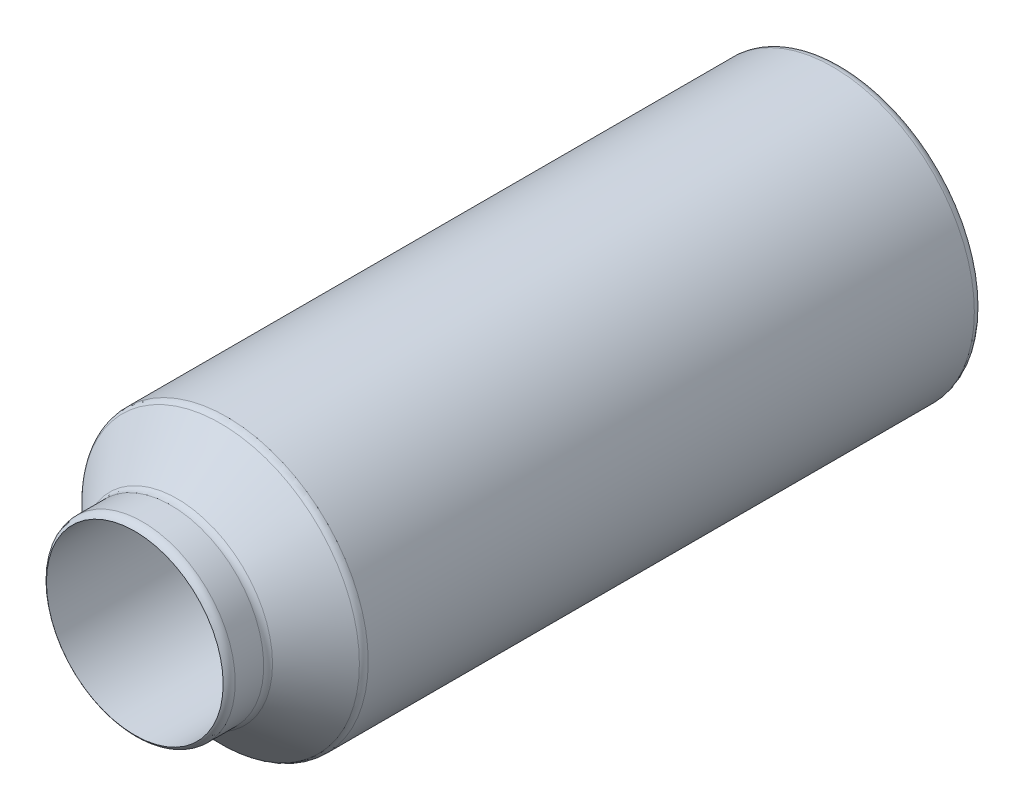
ISO-10303-21;
HEADER;
FILE_DESCRIPTION(('STEP AP214'),'2;1');
FILE_NAME('part.step','',(''),(''),'','','');
FILE_SCHEMA(('AUTOMOTIVE_DESIGN { 1 0 10303 214 1 1 1 1 }'));
ENDSEC;
DATA;
#1=APPLICATION_CONTEXT('core data for automotive mechanical design processes');
#2=APPLICATION_PROTOCOL_DEFINITION('international standard','automotive_design',2000,#1);
#3=PRODUCT_CONTEXT('',#1,'mechanical');
#4=PRODUCT('Part','Part','',(#3));
#5=PRODUCT_RELATED_PRODUCT_CATEGORY('part','',(#4));
#6=PRODUCT_DEFINITION_FORMATION('','',#4);
#7=PRODUCT_DEFINITION_CONTEXT('part definition',#1,'design');
#8=PRODUCT_DEFINITION('design','',#6,#7);
#9=PRODUCT_DEFINITION_SHAPE('','',#8);
#10=(LENGTH_UNIT() NAMED_UNIT(*) SI_UNIT(.MILLI.,.METRE.));
#11=(NAMED_UNIT(*) PLANE_ANGLE_UNIT() SI_UNIT($,.RADIAN.));
#12=(NAMED_UNIT(*) SI_UNIT($,.STERADIAN.) SOLID_ANGLE_UNIT());
#13=UNCERTAINTY_MEASURE_WITH_UNIT(LENGTH_MEASURE(1.E-05),#10,'distance_accuracy_value','');
#14=(GEOMETRIC_REPRESENTATION_CONTEXT(3) GLOBAL_UNCERTAINTY_ASSIGNED_CONTEXT((#13)) GLOBAL_UNIT_ASSIGNED_CONTEXT((#10,
#11,#12)) REPRESENTATION_CONTEXT('',''));
#15=CARTESIAN_POINT('',(0.,0.,0.));
#16=DIRECTION('',(0.,0.,1.));
#17=DIRECTION('',(1.,0.,0.));
#18=AXIS2_PLACEMENT_3D('',#15,#16,#17);
#19=CARTESIAN_POINT('',(8.,0.,0.));
#20=DIRECTION('',(0.,0.,1.));
#21=DIRECTION('',(1.,0.,0.));
#22=AXIS2_PLACEMENT_3D('',#19,#20,#21);
#23=PLANE('',#22);
#24=CARTESIAN_POINT('',(0.,0.,0.));
#25=DIRECTION('',(0.,0.,1.));
#26=DIRECTION('',(1.,0.,0.));
#27=AXIS2_PLACEMENT_3D('',#24,#25,#26);
#28=CIRCLE('',#27,5.5);
#29=CARTESIAN_POINT('',(5.5,0.,0.));
#30=VERTEX_POINT('',#29);
#31=EDGE_CURVE('E10',#30,#30,#28,.T.);
#32=ORIENTED_EDGE('',*,*,#31,.T.);
#33=EDGE_LOOP('',(#32));
#34=FACE_BOUND('',#33,.T.);
#35=CARTESIAN_POINT('',(0.,0.,0.));
#36=DIRECTION('',(0.,0.,1.));
#37=DIRECTION('',(1.,0.,0.));
#38=AXIS2_PLACEMENT_3D('',#35,#36,#37);
#39=CIRCLE('',#38,7.5);
#40=CARTESIAN_POINT('',(7.5,0.,0.));
#41=VERTEX_POINT('',#40);
#42=EDGE_CURVE('E49',#41,#41,#39,.F.);
#43=ORIENTED_EDGE('',*,*,#42,.T.);
#44=EDGE_LOOP('',(#43));
#45=FACE_BOUND('',#44,.T.);
#46=ADVANCED_FACE('F41',(#34,#45),#23,.F.);
#47=CARTESIAN_POINT('',(0.,0.,0.));
#48=DIRECTION('',(0.,0.,-1.));
#49=DIRECTION('',(-1.,0.,0.));
#50=AXIS2_PLACEMENT_3D('',#47,#48,#49);
#51=CYLINDRICAL_SURFACE('',#50,5.);
#52=CARTESIAN_POINT('',(0.,0.,0.500000000000001));
#53=DIRECTION('',(0.,0.,1.));
#54=DIRECTION('',(1.,0.,0.));
#55=AXIS2_PLACEMENT_3D('',#52,#53,#54);
#56=CIRCLE('',#55,5.);
#57=CARTESIAN_POINT('',(5.,0.,0.500000000000001));
#58=VERTEX_POINT('',#57);
#59=EDGE_CURVE('E55',#58,#58,#56,.F.);
#60=ORIENTED_EDGE('',*,*,#59,.T.);
#61=EDGE_LOOP('',(#60));
#62=FACE_BOUND('',#61,.T.);
#63=CARTESIAN_POINT('',(0.,0.,40.));
#64=DIRECTION('',(0.,0.,-1.));
#65=DIRECTION('',(-1.,0.,0.));
#66=AXIS2_PLACEMENT_3D('',#63,#64,#65);
#67=CIRCLE('',#66,5.);
#68=CARTESIAN_POINT('',(-5.,0.,40.));
#69=VERTEX_POINT('',#68);
#70=EDGE_CURVE('E87',#69,#69,#67,.T.);
#71=ORIENTED_EDGE('',*,*,#70,.F.);
#72=EDGE_LOOP('',(#71));
#73=FACE_BOUND('',#72,.T.);
#74=ADVANCED_FACE('F96',(#62,#73),#51,.F.);
#75=CARTESIAN_POINT('',(0.,0.,0.));
#76=DIRECTION('',(0.,0.,-1.));
#77=DIRECTION('',(-1.,0.,0.));
#78=AXIS2_PLACEMENT_3D('',#75,#76,#77);
#79=CYLINDRICAL_SURFACE('',#78,5.25000000000001);
#80=CARTESIAN_POINT('',(0.,0.,39.5669872981078));
#81=DIRECTION('',(0.,0.,1.));
#82=DIRECTION('',(1.,0.,0.));
#83=AXIS2_PLACEMENT_3D('',#80,#81,#82);
#84=CIRCLE('',#83,5.25000000000001);
#85=CARTESIAN_POINT('',(5.25000000000001,0.,39.5669872981078));
#86=VERTEX_POINT('',#85);
#87=EDGE_CURVE('E79',#86,#86,#84,.F.);
#88=ORIENTED_EDGE('',*,*,#87,.T.);
#89=EDGE_LOOP('',(#88));
#90=FACE_BOUND('',#89,.T.);
#91=CARTESIAN_POINT('',(0.,0.,37.9571067811865));
#92=DIRECTION('',(0.,0.,-1.));
#93=DIRECTION('',(-1.,0.,0.));
#94=AXIS2_PLACEMENT_3D('',#91,#92,#93);
#95=CIRCLE('',#94,5.25000000000001);
#96=CARTESIAN_POINT('',(-5.25000000000001,0.,37.9571067811865));
#97=VERTEX_POINT('',#96);
#98=EDGE_CURVE('E83',#97,#97,#95,.F.);
#99=ORIENTED_EDGE('',*,*,#98,.T.);
#100=EDGE_LOOP('',(#99));
#101=FACE_BOUND('',#100,.T.);
#102=ADVANCED_FACE('F98',(#90,#101),#79,.T.);
#103=CARTESIAN_POINT('',(0.,0.,37.75));
#104=DIRECTION('',(0.,0.,-1.));
#105=DIRECTION('',(-1.,0.,0.));
#106=AXIS2_PLACEMENT_3D('',#103,#104,#105);
#107=CONICAL_SURFACE('',#106,5.25000000000001,0.78539816339745);
#108=CARTESIAN_POINT('',(0.,0.,37.6035533905933));
#109=DIRECTION('',(0.,0.,-1.));
#110=DIRECTION('',(-1.,0.,0.));
#111=AXIS2_PLACEMENT_3D('',#108,#109,#110);
#112=CIRCLE('',#111,5.39644660940674);
#113=CARTESIAN_POINT('',(-5.39644660940674,0.,37.6035533905933));
#114=VERTEX_POINT('',#113);
#115=EDGE_CURVE('E71',#114,#114,#112,.T.);
#116=ORIENTED_EDGE('',*,*,#115,.T.);
#117=EDGE_LOOP('',(#116));
#118=FACE_BOUND('',#117,.T.);
#119=CARTESIAN_POINT('',(0.,0.,35.1464466094067));
#120=DIRECTION('',(0.,0.,1.));
#121=DIRECTION('',(1.,0.,0.));
#122=AXIS2_PLACEMENT_3D('',#119,#120,#121);
#123=CIRCLE('',#122,7.85355339059328);
#124=CARTESIAN_POINT('',(7.85355339059328,0.,35.1464466094067));
#125=VERTEX_POINT('',#124);
#126=EDGE_CURVE('E75',#125,#125,#123,.T.);
#127=ORIENTED_EDGE('',*,*,#126,.T.);
#128=EDGE_LOOP('',(#127));
#129=FACE_BOUND('',#128,.T.);
#130=ADVANCED_FACE('F105',(#118,#129),#107,.T.);
#131=CARTESIAN_POINT('',(0.,0.,0.));
#132=DIRECTION('',(0.,0.,-1.));
#133=DIRECTION('',(-1.,0.,0.));
#134=AXIS2_PLACEMENT_3D('',#131,#132,#133);
#135=CYLINDRICAL_SURFACE('',#134,8.);
#136=CARTESIAN_POINT('',(0.,0.,34.7928932188135));
#137=DIRECTION('',(0.,0.,1.));
#138=DIRECTION('',(1.,0.,0.));
#139=AXIS2_PLACEMENT_3D('',#136,#137,#138);
#140=CIRCLE('',#139,8.);
#141=CARTESIAN_POINT('',(8.,0.,34.7928932188135));
#142=VERTEX_POINT('',#141);
#143=EDGE_CURVE('E61',#142,#142,#140,.F.);
#144=ORIENTED_EDGE('',*,*,#143,.T.);
#145=EDGE_LOOP('',(#144));
#146=FACE_BOUND('',#145,.T.);
#147=CARTESIAN_POINT('',(0.,0.,0.500000000000001));
#148=DIRECTION('',(0.,0.,1.));
#149=DIRECTION('',(1.,0.,0.));
#150=AXIS2_PLACEMENT_3D('',#147,#148,#149);
#151=CIRCLE('',#150,8.);
#152=CARTESIAN_POINT('',(8.,0.,0.500000000000001));
#153=VERTEX_POINT('',#152);
#154=EDGE_CURVE('E67',#153,#153,#151,.T.);
#155=ORIENTED_EDGE('',*,*,#154,.T.);
#156=EDGE_LOOP('',(#155));
#157=FACE_BOUND('',#156,.T.);
#158=ADVANCED_FACE('F114',(#146,#157),#135,.T.);
#159=CARTESIAN_POINT('',(0.,0.,39.5669872981078));
#160=DIRECTION('',(0.,0.,1.));
#161=DIRECTION('',(1.,0.,0.));
#162=AXIS2_PLACEMENT_3D('',#159,#160,#161);
#163=TOROIDAL_SURFACE('',#162,4.75000000000001,0.5);
#164=ORIENTED_EDGE('',*,*,#70,.T.);
#165=EDGE_LOOP('',(#164));
#166=FACE_BOUND('',#165,.T.);
#167=ORIENTED_EDGE('',*,*,#87,.F.);
#168=EDGE_LOOP('',(#167));
#169=FACE_BOUND('',#168,.T.);
#170=ADVANCED_FACE('F93',(#166,#169),#163,.T.);
#171=CARTESIAN_POINT('',(0.,0.,37.9571067811865));
#172=DIRECTION('',(0.,0.,-1.));
#173=DIRECTION('',(-1.,0.,0.));
#174=AXIS2_PLACEMENT_3D('',#171,#172,#173);
#175=TOROIDAL_SURFACE('',#174,5.75000000000001,0.5);
#176=ORIENTED_EDGE('',*,*,#98,.F.);
#177=EDGE_LOOP('',(#176));
#178=FACE_BOUND('',#177,.T.);
#179=ORIENTED_EDGE('',*,*,#115,.F.);
#180=EDGE_LOOP('',(#179));
#181=FACE_BOUND('',#180,.T.);
#182=ADVANCED_FACE('F113',(#178,#181),#175,.F.);
#183=CARTESIAN_POINT('',(0.,0.,34.7928932188135));
#184=DIRECTION('',(0.,0.,1.));
#185=DIRECTION('',(1.,0.,0.));
#186=AXIS2_PLACEMENT_3D('',#183,#184,#185);
#187=TOROIDAL_SURFACE('',#186,7.5,0.5);
#188=ORIENTED_EDGE('',*,*,#126,.F.);
#189=EDGE_LOOP('',(#188));
#190=FACE_BOUND('',#189,.T.);
#191=ORIENTED_EDGE('',*,*,#143,.F.);
#192=EDGE_LOOP('',(#191));
#193=FACE_BOUND('',#192,.T.);
#194=ADVANCED_FACE('F117',(#190,#193),#187,.T.);
#195=CARTESIAN_POINT('',(0.,0.,0.500000000000001));
#196=DIRECTION('',(0.,0.,1.));
#197=DIRECTION('',(1.,0.,0.));
#198=AXIS2_PLACEMENT_3D('',#195,#196,#197);
#199=TOROIDAL_SURFACE('',#198,5.5,0.5);
#200=ORIENTED_EDGE('',*,*,#31,.F.);
#201=EDGE_LOOP('',(#200));
#202=FACE_BOUND('',#201,.T.);
#203=ORIENTED_EDGE('',*,*,#59,.F.);
#204=EDGE_LOOP('',(#203));
#205=FACE_BOUND('',#204,.T.);
#206=ADVANCED_FACE('F120',(#202,#205),#199,.T.);
#207=CARTESIAN_POINT('',(0.,0.,0.500000000000001));
#208=DIRECTION('',(0.,0.,1.));
#209=DIRECTION('',(1.,0.,0.));
#210=AXIS2_PLACEMENT_3D('',#207,#208,#209);
#211=TOROIDAL_SURFACE('',#210,7.5,0.5);
#212=ORIENTED_EDGE('',*,*,#154,.F.);
#213=EDGE_LOOP('',(#212));
#214=FACE_BOUND('',#213,.T.);
#215=ORIENTED_EDGE('',*,*,#42,.F.);
#216=EDGE_LOOP('',(#215));
#217=FACE_BOUND('',#216,.T.);
#218=ADVANCED_FACE('F43',(#214,#217),#211,.T.);
#219=CLOSED_SHELL('',(#46,#74,#102,#130,#158,#170,#182,#194,#206,#218));
#220=MANIFOLD_SOLID_BREP('B2',#219);
#221=ADVANCED_BREP_SHAPE_REPRESENTATION('',(#18,#220),#14);
#222=SHAPE_DEFINITION_REPRESENTATION(#9,#221);
ENDSEC;
END-ISO-10303-21;
